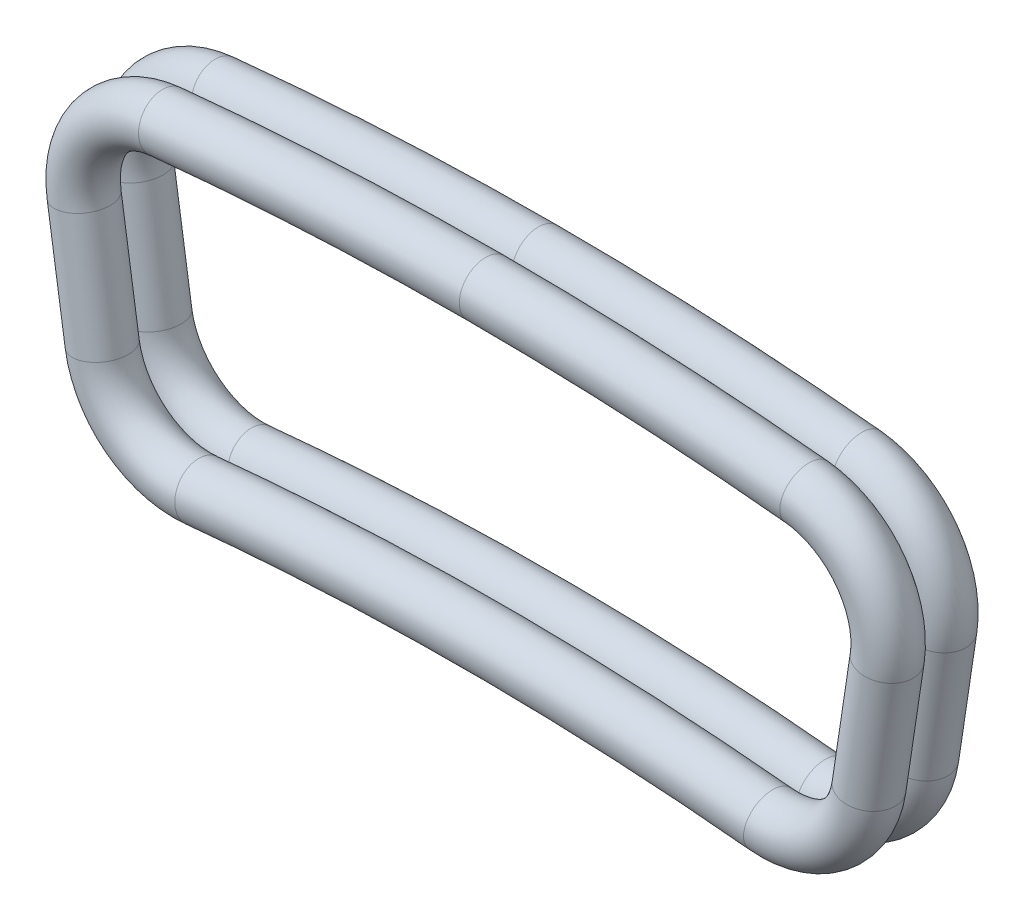
ISO-10303-21;
HEADER;
FILE_DESCRIPTION(('STEP AP214'),'2;1');
FILE_NAME('part.step','',(''),(''),'','','');
FILE_SCHEMA(('AUTOMOTIVE_DESIGN { 1 0 10303 214 1 1 1 1 }'));
ENDSEC;
DATA;
#1=APPLICATION_CONTEXT('core data for automotive mechanical design processes');
#2=APPLICATION_PROTOCOL_DEFINITION('international standard','automotive_design',2000,#1);
#3=PRODUCT_CONTEXT('',#1,'mechanical');
#4=PRODUCT('Part','Part','',(#3));
#5=PRODUCT_RELATED_PRODUCT_CATEGORY('part','',(#4));
#6=PRODUCT_DEFINITION_FORMATION('','',#4);
#7=PRODUCT_DEFINITION_CONTEXT('part definition',#1,'design');
#8=PRODUCT_DEFINITION('design','',#6,#7);
#9=PRODUCT_DEFINITION_SHAPE('','',#8);
#10=(LENGTH_UNIT() NAMED_UNIT(*) SI_UNIT(.MILLI.,.METRE.));
#11=(NAMED_UNIT(*) PLANE_ANGLE_UNIT() SI_UNIT($,.RADIAN.));
#12=(NAMED_UNIT(*) SI_UNIT($,.STERADIAN.) SOLID_ANGLE_UNIT());
#13=UNCERTAINTY_MEASURE_WITH_UNIT(LENGTH_MEASURE(1.E-05),#10,'distance_accuracy_value','');
#14=(GEOMETRIC_REPRESENTATION_CONTEXT(3) GLOBAL_UNCERTAINTY_ASSIGNED_CONTEXT((#13)) GLOBAL_UNIT_ASSIGNED_CONTEXT((#10,
#11,#12)) REPRESENTATION_CONTEXT('',''));
#15=CARTESIAN_POINT('',(0.,0.,0.));
#16=DIRECTION('',(0.,0.,1.));
#17=DIRECTION('',(1.,0.,0.));
#18=AXIS2_PLACEMENT_3D('',#15,#16,#17);
#19=CARTESIAN_POINT('',(0.,0.,-1.558));
#20=DIRECTION('',(0.,0.,-1.));
#21=DIRECTION('',(-1.,0.,0.));
#22=AXIS2_PLACEMENT_3D('',#19,#20,#21);
#23=TOROIDAL_SURFACE('',#22,98.186,0.814000000000004);
#24=CARTESIAN_POINT('',(-9.90528882125347,97.6850850916738,-1.558));
#25=DIRECTION('',(0.994898306191044,0.100882904092778,0.));
#26=DIRECTION('',(0.,0.,-1.));
#27=AXIS2_PLACEMENT_3D('',#24,#25,#26);
#28=CIRCLE('',#27,0.814000000000004);
#29=CARTESIAN_POINT('',(-9.98740750518499,98.4949323129133,-1.558));
#30=VERTEX_POINT('',#29);
#31=EDGE_CURVE('E11',#30,#30,#28,.T.);
#32=CARTESIAN_POINT('',(0.,98.186,-1.558));
#33=DIRECTION('',(1.,0.,0.));
#34=DIRECTION('',(0.,0.,-1.));
#35=AXIS2_PLACEMENT_3D('',#32,#33,#34);
#36=CIRCLE('',#35,0.814000000000004);
#37=CARTESIAN_POINT('',(0.,99.,-1.558));
#38=VERTEX_POINT('',#37);
#39=EDGE_CURVE('E78',#38,#38,#36,.T.);
#40=CARTESIAN_POINT('',(0.,0.,-1.558));
#41=DIRECTION('',(0.,0.,-1.));
#42=DIRECTION('',(-1.,0.,0.));
#43=AXIS2_PLACEMENT_3D('',#40,#41,#42);
#44=CIRCLE('',#43,99.);
#45=EDGE_CURVE('',#30,#38,#44,.T.);
#46=ORIENTED_EDGE('',*,*,#31,.T.);
#47=ORIENTED_EDGE('',*,*,#39,.F.);
#48=ORIENTED_EDGE('',*,*,#45,.T.);
#49=ORIENTED_EDGE('',*,*,#45,.F.);
#50=EDGE_LOOP('',(#46,#48,#47,#49));
#51=FACE_BOUND('',#50,.T.);
#52=ADVANCED_FACE('F47',(#51),#23,.T.);
#53=CARTESIAN_POINT('',(-9.62140432913657,94.8854412580522,-1.558));
#54=DIRECTION('',(0.,0.,-1.));
#55=DIRECTION('',(-1.,0.,0.));
#56=AXIS2_PLACEMENT_3D('',#53,#54,#55);
#57=TOROIDAL_SURFACE('',#56,2.81400000000001,0.814000000000004);
#58=CARTESIAN_POINT('',(-12.4039742741341,94.4660363210325,-1.558));
#59=DIRECTION('',(-0.149042266176174,0.988830826225129,0.));
#60=DIRECTION('',(0.,0.,-1.));
#61=AXIS2_PLACEMENT_3D('',#58,#59,#60);
#62=CIRCLE('',#61,0.814000000000004);
#63=CARTESIAN_POINT('',(-13.2088825666813,94.3447159163651,-1.558));
#64=VERTEX_POINT('',#63);
#65=EDGE_CURVE('E53',#64,#64,#62,.T.);
#66=CARTESIAN_POINT('',(-9.62140432913657,94.8854412580522,-1.558));
#67=DIRECTION('',(0.,0.,-1.));
#68=DIRECTION('',(-1.,0.,0.));
#69=AXIS2_PLACEMENT_3D('',#66,#67,#68);
#70=CIRCLE('',#69,3.62800000000001);
#71=EDGE_CURVE('',#64,#30,#70,.T.);
#72=ORIENTED_EDGE('',*,*,#65,.T.);
#73=ORIENTED_EDGE('',*,*,#31,.F.);
#74=ORIENTED_EDGE('',*,*,#71,.T.);
#75=ORIENTED_EDGE('',*,*,#71,.F.);
#76=EDGE_LOOP('',(#72,#74,#73,#75));
#77=FACE_BOUND('',#76,.T.);
#78=ADVANCED_FACE('F85',(#77),#57,.T.);
#79=CARTESIAN_POINT('',(-11.8452749318046,90.7593083809587,-1.558));
#80=DIRECTION('',(-0.149042266176174,0.988830826225129,0.));
#81=DIRECTION('',(-0.988830826225129,-0.149042266176174,0.));
#82=AXIS2_PLACEMENT_3D('',#79,#80,#81);
#83=CYLINDRICAL_SURFACE('',#82,0.814000000000004);
#84=ORIENTED_EDGE('',*,*,#65,.F.);
#85=EDGE_LOOP('',(#84));
#86=FACE_BOUND('',#85,.T.);
#87=CARTESIAN_POINT('',(-11.8452749318046,90.7593083809587,-1.558));
#88=DIRECTION('',(-0.149042266176173,0.988830826225129,0.));
#89=DIRECTION('',(0.,0.,-1.));
#90=AXIS2_PLACEMENT_3D('',#87,#88,#89);
#91=CIRCLE('',#90,0.814000000000004);
#92=CARTESIAN_POINT('',(-12.6501832243518,90.6379879762913,-1.558));
#93=VERTEX_POINT('',#92);
#94=EDGE_CURVE('E57',#93,#93,#91,.T.);
#95=ORIENTED_EDGE('',*,*,#94,.T.);
#96=EDGE_LOOP('',(#95));
#97=FACE_BOUND('',#96,.T.);
#98=ADVANCED_FACE('F89',(#86,#97),#83,.T.);
#99=CARTESIAN_POINT('',(-9.06270498680705,91.1787133179785,-1.558));
#100=DIRECTION('',(0.,0.,-1.));
#101=DIRECTION('',(-1.,0.,0.));
#102=AXIS2_PLACEMENT_3D('',#99,#100,#101);
#103=TOROIDAL_SURFACE('',#102,2.81399999999999,0.814000000000004);
#104=CARTESIAN_POINT('',(-8.78437901840359,88.378511422523,-1.558));
#105=DIRECTION('',(-0.995096622407763,-0.098907593604652,0.));
#106=DIRECTION('',(0.,0.,-1.));
#107=AXIS2_PLACEMENT_3D('',#104,#105,#106);
#108=CIRCLE('',#107,0.814000000000004);
#109=CARTESIAN_POINT('',(-8.70386823720942,87.5685027718831,-1.558));
#110=VERTEX_POINT('',#109);
#111=EDGE_CURVE('E61',#110,#110,#108,.T.);
#112=CARTESIAN_POINT('',(-9.06270498680705,91.1787133179785,-1.558));
#113=DIRECTION('',(0.,0.,-1.));
#114=DIRECTION('',(-1.,0.,0.));
#115=AXIS2_PLACEMENT_3D('',#112,#113,#114);
#116=CIRCLE('',#115,3.62799999999999);
#117=EDGE_CURVE('',#110,#93,#116,.T.);
#118=ORIENTED_EDGE('',*,*,#111,.T.);
#119=ORIENTED_EDGE('',*,*,#94,.F.);
#120=ORIENTED_EDGE('',*,*,#117,.T.);
#121=ORIENTED_EDGE('',*,*,#117,.F.);
#122=EDGE_LOOP('',(#118,#120,#119,#121));
#123=FACE_BOUND('',#122,.T.);
#124=ADVANCED_FACE('F94',(#123),#103,.T.);
#125=CARTESIAN_POINT('',(0.,0.,-1.558));
#126=DIRECTION('',(0.,0.,1.));
#127=DIRECTION('',(1.,0.,0.));
#128=AXIS2_PLACEMENT_3D('',#125,#126,#127);
#129=TOROIDAL_SURFACE('',#128,88.814,0.814000000000004);
#130=ORIENTED_EDGE('',*,*,#111,.F.);
#131=EDGE_LOOP('',(#130));
#132=FACE_BOUND('',#131,.T.);
#133=CARTESIAN_POINT('',(8.78437901840353,88.378511422523,-1.558));
#134=DIRECTION('',(-0.995096622407762,0.0989075936046599,0.));
#135=DIRECTION('',(0.,0.,-1.));
#136=AXIS2_PLACEMENT_3D('',#133,#134,#135);
#137=CIRCLE('',#136,0.814000000000004);
#138=CARTESIAN_POINT('',(8.70386823720933,87.5685027718831,-1.558));
#139=VERTEX_POINT('',#138);
#140=EDGE_CURVE('E66',#139,#139,#137,.T.);
#141=ORIENTED_EDGE('',*,*,#140,.T.);
#142=EDGE_LOOP('',(#141));
#143=FACE_BOUND('',#142,.T.);
#144=ADVANCED_FACE('F100',(#132,#143),#129,.T.);
#145=CARTESIAN_POINT('',(9.06270498680706,91.1787133179785,-1.558));
#146=DIRECTION('',(0.,0.,-1.));
#147=DIRECTION('',(-1.,0.,0.));
#148=AXIS2_PLACEMENT_3D('',#145,#146,#147);
#149=TOROIDAL_SURFACE('',#148,2.814,0.814000000000004);
#150=CARTESIAN_POINT('',(11.8452749318046,90.7593083809587,-1.558));
#151=DIRECTION('',(-0.149042266176172,-0.988830826225129,0.));
#152=DIRECTION('',(0.,0.,-1.));
#153=AXIS2_PLACEMENT_3D('',#150,#151,#152);
#154=CIRCLE('',#153,0.814000000000004);
#155=CARTESIAN_POINT('',(12.6501832243518,90.6379879762913,-1.558));
#156=VERTEX_POINT('',#155);
#157=EDGE_CURVE('E69',#156,#156,#154,.T.);
#158=CARTESIAN_POINT('',(9.06270498680706,91.1787133179785,-1.558));
#159=DIRECTION('',(0.,0.,-1.));
#160=DIRECTION('',(-1.,0.,0.));
#161=AXIS2_PLACEMENT_3D('',#158,#159,#160);
#162=CIRCLE('',#161,3.628);
#163=EDGE_CURVE('',#156,#139,#162,.T.);
#164=ORIENTED_EDGE('',*,*,#157,.T.);
#165=ORIENTED_EDGE('',*,*,#140,.F.);
#166=ORIENTED_EDGE('',*,*,#163,.T.);
#167=ORIENTED_EDGE('',*,*,#163,.F.);
#168=EDGE_LOOP('',(#164,#166,#165,#167));
#169=FACE_BOUND('',#168,.T.);
#170=ADVANCED_FACE('F104',(#169),#149,.T.);
#171=CARTESIAN_POINT('',(12.4039742741341,94.4660363210324,-1.558));
#172=DIRECTION('',(-0.149042266176172,-0.988830826225129,0.));
#173=DIRECTION('',(0.988830826225129,-0.149042266176172,0.));
#174=AXIS2_PLACEMENT_3D('',#171,#172,#173);
#175=CYLINDRICAL_SURFACE('',#174,0.814000000000004);
#176=ORIENTED_EDGE('',*,*,#157,.F.);
#177=EDGE_LOOP('',(#176));
#178=FACE_BOUND('',#177,.T.);
#179=CARTESIAN_POINT('',(12.4039742741341,94.4660363210324,-1.558));
#180=DIRECTION('',(-0.149042266176173,-0.988830826225129,0.));
#181=DIRECTION('',(0.,0.,-1.));
#182=AXIS2_PLACEMENT_3D('',#179,#180,#181);
#183=CIRCLE('',#182,0.814000000000004);
#184=CARTESIAN_POINT('',(13.2088825666813,94.344715916365,-1.558));
#185=VERTEX_POINT('',#184);
#186=EDGE_CURVE('E72',#185,#185,#183,.T.);
#187=ORIENTED_EDGE('',*,*,#186,.T.);
#188=EDGE_LOOP('',(#187));
#189=FACE_BOUND('',#188,.T.);
#190=ADVANCED_FACE('F108',(#178,#189),#175,.T.);
#191=CARTESIAN_POINT('',(9.62140432913657,94.8854412580522,-1.558));
#192=DIRECTION('',(0.,0.,-1.));
#193=DIRECTION('',(-1.,0.,0.));
#194=AXIS2_PLACEMENT_3D('',#191,#192,#193);
#195=TOROIDAL_SURFACE('',#194,2.814,0.814000000000004);
#196=CARTESIAN_POINT('',(9.90528882125363,97.6850850916738,-1.558));
#197=DIRECTION('',(0.994898306191043,-0.100882904092779,0.));
#198=DIRECTION('',(0.,0.,-1.));
#199=AXIS2_PLACEMENT_3D('',#196,#197,#198);
#200=CIRCLE('',#199,0.814000000000004);
#201=CARTESIAN_POINT('',(9.98740750518514,98.4949323129133,-1.558));
#202=VERTEX_POINT('',#201);
#203=EDGE_CURVE('E75',#202,#202,#200,.T.);
#204=CARTESIAN_POINT('',(9.62140432913657,94.8854412580522,-1.558));
#205=DIRECTION('',(0.,0.,-1.));
#206=DIRECTION('',(-1.,0.,0.));
#207=AXIS2_PLACEMENT_3D('',#204,#205,#206);
#208=CIRCLE('',#207,3.628);
#209=EDGE_CURVE('',#202,#185,#208,.T.);
#210=ORIENTED_EDGE('',*,*,#203,.T.);
#211=ORIENTED_EDGE('',*,*,#186,.F.);
#212=ORIENTED_EDGE('',*,*,#209,.T.);
#213=ORIENTED_EDGE('',*,*,#209,.F.);
#214=EDGE_LOOP('',(#210,#212,#211,#213));
#215=FACE_BOUND('',#214,.T.);
#216=ADVANCED_FACE('F112',(#215),#195,.T.);
#217=CARTESIAN_POINT('',(0.,0.,-1.558));
#218=DIRECTION('',(0.,0.,-1.));
#219=DIRECTION('',(-1.,0.,0.));
#220=AXIS2_PLACEMENT_3D('',#217,#218,#219);
#221=TOROIDAL_SURFACE('',#220,98.186,0.814000000000004);
#222=CARTESIAN_POINT('',(0.,0.,-1.558));
#223=DIRECTION('',(0.,0.,-1.));
#224=DIRECTION('',(-1.,0.,0.));
#225=AXIS2_PLACEMENT_3D('',#222,#223,#224);
#226=CIRCLE('',#225,99.);
#227=EDGE_CURVE('',#38,#202,#226,.T.);
#228=ORIENTED_EDGE('',*,*,#39,.T.);
#229=ORIENTED_EDGE('',*,*,#203,.F.);
#230=ORIENTED_EDGE('',*,*,#227,.T.);
#231=ORIENTED_EDGE('',*,*,#227,.F.);
#232=EDGE_LOOP('',(#228,#230,#229,#231));
#233=FACE_BOUND('',#232,.T.);
#234=ADVANCED_FACE('F82',(#233),#221,.T.);
#235=CLOSED_SHELL('',(#52,#78,#98,#124,#144,#170,#190,#216,#234));
#236=MANIFOLD_SOLID_BREP('B2',#235);
#237=CARTESIAN_POINT('',(0.,0.,-3.186));
#238=DIRECTION('',(0.,0.,-1.));
#239=DIRECTION('',(-1.,0.,0.));
#240=AXIS2_PLACEMENT_3D('',#237,#238,#239);
#241=TOROIDAL_SURFACE('',#240,98.186,0.814000000000004);
#242=CARTESIAN_POINT('',(-9.90528882125347,97.6850850916738,-3.186));
#243=DIRECTION('',(0.994898306191044,0.100882904092778,0.));
#244=DIRECTION('',(0.,0.,-1.));
#245=AXIS2_PLACEMENT_3D('',#242,#243,#244);
#246=CIRCLE('',#245,0.814000000000004);
#247=CARTESIAN_POINT('',(-9.98740750518499,98.4949323129133,-3.186));
#248=VERTEX_POINT('',#247);
#249=EDGE_CURVE('E46',#248,#248,#246,.T.);
#250=CARTESIAN_POINT('',(0.,98.186,-3.186));
#251=DIRECTION('',(1.,0.,0.));
#252=DIRECTION('',(0.,0.,-1.));
#253=AXIS2_PLACEMENT_3D('',#250,#251,#252);
#254=CIRCLE('',#253,0.814000000000004);
#255=CARTESIAN_POINT('',(0.,99.,-3.186));
#256=VERTEX_POINT('',#255);
#257=EDGE_CURVE('E215',#256,#256,#254,.T.);
#258=CARTESIAN_POINT('',(0.,0.,-3.186));
#259=DIRECTION('',(0.,0.,-1.));
#260=DIRECTION('',(-1.,0.,0.));
#261=AXIS2_PLACEMENT_3D('',#258,#259,#260);
#262=CIRCLE('',#261,99.);
#263=EDGE_CURVE('',#248,#256,#262,.T.);
#264=ORIENTED_EDGE('',*,*,#249,.T.);
#265=ORIENTED_EDGE('',*,*,#257,.F.);
#266=ORIENTED_EDGE('',*,*,#263,.T.);
#267=ORIENTED_EDGE('',*,*,#263,.F.);
#268=EDGE_LOOP('',(#264,#266,#265,#267));
#269=FACE_BOUND('',#268,.T.);
#270=ADVANCED_FACE('F184',(#269),#241,.T.);
#271=CARTESIAN_POINT('',(-9.62140432913657,94.8854412580522,-3.186));
#272=DIRECTION('',(0.,0.,-1.));
#273=DIRECTION('',(-1.,0.,0.));
#274=AXIS2_PLACEMENT_3D('',#271,#272,#273);
#275=TOROIDAL_SURFACE('',#274,2.81400000000001,0.814000000000004);
#276=CARTESIAN_POINT('',(-12.4039742741341,94.4660363210325,-3.186));
#277=DIRECTION('',(-0.149042266176174,0.988830826225129,0.));
#278=DIRECTION('',(0.,0.,-1.));
#279=AXIS2_PLACEMENT_3D('',#276,#277,#278);
#280=CIRCLE('',#279,0.814000000000004);
#281=CARTESIAN_POINT('',(-13.2088825666813,94.3447159163651,-3.186));
#282=VERTEX_POINT('',#281);
#283=EDGE_CURVE('E190',#282,#282,#280,.T.);
#284=CARTESIAN_POINT('',(-9.62140432913657,94.8854412580522,-3.186));
#285=DIRECTION('',(0.,0.,-1.));
#286=DIRECTION('',(-1.,0.,0.));
#287=AXIS2_PLACEMENT_3D('',#284,#285,#286);
#288=CIRCLE('',#287,3.62800000000001);
#289=EDGE_CURVE('',#282,#248,#288,.T.);
#290=ORIENTED_EDGE('',*,*,#283,.T.);
#291=ORIENTED_EDGE('',*,*,#249,.F.);
#292=ORIENTED_EDGE('',*,*,#289,.T.);
#293=ORIENTED_EDGE('',*,*,#289,.F.);
#294=EDGE_LOOP('',(#290,#292,#291,#293));
#295=FACE_BOUND('',#294,.T.);
#296=ADVANCED_FACE('F222',(#295),#275,.T.);
#297=CARTESIAN_POINT('',(-11.8452749318046,90.7593083809587,-3.186));
#298=DIRECTION('',(-0.149042266176174,0.988830826225129,0.));
#299=DIRECTION('',(-0.988830826225129,-0.149042266176174,0.));
#300=AXIS2_PLACEMENT_3D('',#297,#298,#299);
#301=CYLINDRICAL_SURFACE('',#300,0.814000000000004);
#302=ORIENTED_EDGE('',*,*,#283,.F.);
#303=EDGE_LOOP('',(#302));
#304=FACE_BOUND('',#303,.T.);
#305=CARTESIAN_POINT('',(-11.8452749318046,90.7593083809587,-3.186));
#306=DIRECTION('',(-0.149042266176173,0.988830826225129,0.));
#307=DIRECTION('',(0.,0.,-1.));
#308=AXIS2_PLACEMENT_3D('',#305,#306,#307);
#309=CIRCLE('',#308,0.814000000000004);
#310=CARTESIAN_POINT('',(-12.6501832243518,90.6379879762913,-3.186));
#311=VERTEX_POINT('',#310);
#312=EDGE_CURVE('E194',#311,#311,#309,.T.);
#313=ORIENTED_EDGE('',*,*,#312,.T.);
#314=EDGE_LOOP('',(#313));
#315=FACE_BOUND('',#314,.T.);
#316=ADVANCED_FACE('F226',(#304,#315),#301,.T.);
#317=CARTESIAN_POINT('',(-9.06270498680705,91.1787133179785,-3.186));
#318=DIRECTION('',(0.,0.,-1.));
#319=DIRECTION('',(-1.,0.,0.));
#320=AXIS2_PLACEMENT_3D('',#317,#318,#319);
#321=TOROIDAL_SURFACE('',#320,2.81399999999999,0.814000000000004);
#322=CARTESIAN_POINT('',(-8.78437901840359,88.378511422523,-3.186));
#323=DIRECTION('',(-0.995096622407763,-0.098907593604652,0.));
#324=DIRECTION('',(0.,0.,-1.));
#325=AXIS2_PLACEMENT_3D('',#322,#323,#324);
#326=CIRCLE('',#325,0.814000000000004);
#327=CARTESIAN_POINT('',(-8.70386823720942,87.5685027718831,-3.186));
#328=VERTEX_POINT('',#327);
#329=EDGE_CURVE('E198',#328,#328,#326,.T.);
#330=CARTESIAN_POINT('',(-9.06270498680705,91.1787133179785,-3.186));
#331=DIRECTION('',(0.,0.,-1.));
#332=DIRECTION('',(-1.,0.,0.));
#333=AXIS2_PLACEMENT_3D('',#330,#331,#332);
#334=CIRCLE('',#333,3.62799999999999);
#335=EDGE_CURVE('',#328,#311,#334,.T.);
#336=ORIENTED_EDGE('',*,*,#329,.T.);
#337=ORIENTED_EDGE('',*,*,#312,.F.);
#338=ORIENTED_EDGE('',*,*,#335,.T.);
#339=ORIENTED_EDGE('',*,*,#335,.F.);
#340=EDGE_LOOP('',(#336,#338,#337,#339));
#341=FACE_BOUND('',#340,.T.);
#342=ADVANCED_FACE('F231',(#341),#321,.T.);
#343=CARTESIAN_POINT('',(0.,0.,-3.186));
#344=DIRECTION('',(0.,0.,1.));
#345=DIRECTION('',(1.,0.,0.));
#346=AXIS2_PLACEMENT_3D('',#343,#344,#345);
#347=TOROIDAL_SURFACE('',#346,88.814,0.814000000000004);
#348=ORIENTED_EDGE('',*,*,#329,.F.);
#349=EDGE_LOOP('',(#348));
#350=FACE_BOUND('',#349,.T.);
#351=CARTESIAN_POINT('',(8.78437901840353,88.378511422523,-3.186));
#352=DIRECTION('',(-0.995096622407762,0.0989075936046599,0.));
#353=DIRECTION('',(0.,0.,-1.));
#354=AXIS2_PLACEMENT_3D('',#351,#352,#353);
#355=CIRCLE('',#354,0.814000000000004);
#356=CARTESIAN_POINT('',(8.70386823720933,87.5685027718831,-3.186));
#357=VERTEX_POINT('',#356);
#358=EDGE_CURVE('E203',#357,#357,#355,.T.);
#359=ORIENTED_EDGE('',*,*,#358,.T.);
#360=EDGE_LOOP('',(#359));
#361=FACE_BOUND('',#360,.T.);
#362=ADVANCED_FACE('F237',(#350,#361),#347,.T.);
#363=CARTESIAN_POINT('',(9.06270498680706,91.1787133179785,-3.186));
#364=DIRECTION('',(0.,0.,-1.));
#365=DIRECTION('',(-1.,0.,0.));
#366=AXIS2_PLACEMENT_3D('',#363,#364,#365);
#367=TOROIDAL_SURFACE('',#366,2.814,0.814000000000004);
#368=CARTESIAN_POINT('',(11.8452749318046,90.7593083809587,-3.186));
#369=DIRECTION('',(-0.149042266176172,-0.988830826225129,0.));
#370=DIRECTION('',(0.,0.,-1.));
#371=AXIS2_PLACEMENT_3D('',#368,#369,#370);
#372=CIRCLE('',#371,0.814000000000004);
#373=CARTESIAN_POINT('',(12.6501832243518,90.6379879762913,-3.186));
#374=VERTEX_POINT('',#373);
#375=EDGE_CURVE('E206',#374,#374,#372,.T.);
#376=CARTESIAN_POINT('',(9.06270498680706,91.1787133179785,-3.186));
#377=DIRECTION('',(0.,0.,-1.));
#378=DIRECTION('',(-1.,0.,0.));
#379=AXIS2_PLACEMENT_3D('',#376,#377,#378);
#380=CIRCLE('',#379,3.628);
#381=EDGE_CURVE('',#374,#357,#380,.T.);
#382=ORIENTED_EDGE('',*,*,#375,.T.);
#383=ORIENTED_EDGE('',*,*,#358,.F.);
#384=ORIENTED_EDGE('',*,*,#381,.T.);
#385=ORIENTED_EDGE('',*,*,#381,.F.);
#386=EDGE_LOOP('',(#382,#384,#383,#385));
#387=FACE_BOUND('',#386,.T.);
#388=ADVANCED_FACE('F241',(#387),#367,.T.);
#389=CARTESIAN_POINT('',(12.4039742741341,94.4660363210324,-3.186));
#390=DIRECTION('',(-0.149042266176172,-0.988830826225129,0.));
#391=DIRECTION('',(0.988830826225129,-0.149042266176172,0.));
#392=AXIS2_PLACEMENT_3D('',#389,#390,#391);
#393=CYLINDRICAL_SURFACE('',#392,0.814000000000004);
#394=ORIENTED_EDGE('',*,*,#375,.F.);
#395=EDGE_LOOP('',(#394));
#396=FACE_BOUND('',#395,.T.);
#397=CARTESIAN_POINT('',(12.4039742741341,94.4660363210324,-3.186));
#398=DIRECTION('',(-0.149042266176173,-0.988830826225129,0.));
#399=DIRECTION('',(0.,0.,-1.));
#400=AXIS2_PLACEMENT_3D('',#397,#398,#399);
#401=CIRCLE('',#400,0.814000000000004);
#402=CARTESIAN_POINT('',(13.2088825666813,94.344715916365,-3.186));
#403=VERTEX_POINT('',#402);
#404=EDGE_CURVE('E209',#403,#403,#401,.T.);
#405=ORIENTED_EDGE('',*,*,#404,.T.);
#406=EDGE_LOOP('',(#405));
#407=FACE_BOUND('',#406,.T.);
#408=ADVANCED_FACE('F245',(#396,#407),#393,.T.);
#409=CARTESIAN_POINT('',(9.62140432913657,94.8854412580522,-3.186));
#410=DIRECTION('',(0.,0.,-1.));
#411=DIRECTION('',(-1.,0.,0.));
#412=AXIS2_PLACEMENT_3D('',#409,#410,#411);
#413=TOROIDAL_SURFACE('',#412,2.814,0.814000000000004);
#414=CARTESIAN_POINT('',(9.90528882125363,97.6850850916738,-3.186));
#415=DIRECTION('',(0.994898306191043,-0.100882904092779,0.));
#416=DIRECTION('',(0.,0.,-1.));
#417=AXIS2_PLACEMENT_3D('',#414,#415,#416);
#418=CIRCLE('',#417,0.814000000000004);
#419=CARTESIAN_POINT('',(9.98740750518514,98.4949323129133,-3.186));
#420=VERTEX_POINT('',#419);
#421=EDGE_CURVE('E212',#420,#420,#418,.T.);
#422=CARTESIAN_POINT('',(9.62140432913657,94.8854412580522,-3.186));
#423=DIRECTION('',(0.,0.,-1.));
#424=DIRECTION('',(-1.,0.,0.));
#425=AXIS2_PLACEMENT_3D('',#422,#423,#424);
#426=CIRCLE('',#425,3.628);
#427=EDGE_CURVE('',#420,#403,#426,.T.);
#428=ORIENTED_EDGE('',*,*,#421,.T.);
#429=ORIENTED_EDGE('',*,*,#404,.F.);
#430=ORIENTED_EDGE('',*,*,#427,.T.);
#431=ORIENTED_EDGE('',*,*,#427,.F.);
#432=EDGE_LOOP('',(#428,#430,#429,#431));
#433=FACE_BOUND('',#432,.T.);
#434=ADVANCED_FACE('F249',(#433),#413,.T.);
#435=CARTESIAN_POINT('',(0.,0.,-3.186));
#436=DIRECTION('',(0.,0.,-1.));
#437=DIRECTION('',(-1.,0.,0.));
#438=AXIS2_PLACEMENT_3D('',#435,#436,#437);
#439=TOROIDAL_SURFACE('',#438,98.186,0.814000000000004);
#440=CARTESIAN_POINT('',(0.,0.,-3.186));
#441=DIRECTION('',(0.,0.,-1.));
#442=DIRECTION('',(-1.,0.,0.));
#443=AXIS2_PLACEMENT_3D('',#440,#441,#442);
#444=CIRCLE('',#443,99.);
#445=EDGE_CURVE('',#256,#420,#444,.T.);
#446=ORIENTED_EDGE('',*,*,#257,.T.);
#447=ORIENTED_EDGE('',*,*,#421,.F.);
#448=ORIENTED_EDGE('',*,*,#445,.T.);
#449=ORIENTED_EDGE('',*,*,#445,.F.);
#450=EDGE_LOOP('',(#446,#448,#447,#449));
#451=FACE_BOUND('',#450,.T.);
#452=ADVANCED_FACE('F219',(#451),#439,.T.);
#453=CLOSED_SHELL('',(#270,#296,#316,#342,#362,#388,#408,#434,#452));
#454=MANIFOLD_SOLID_BREP('B6',#453);
#455=ADVANCED_BREP_SHAPE_REPRESENTATION('',(#18,#236,#454),#14);
#456=SHAPE_DEFINITION_REPRESENTATION(#9,#455);
ENDSEC;
END-ISO-10303-21;
